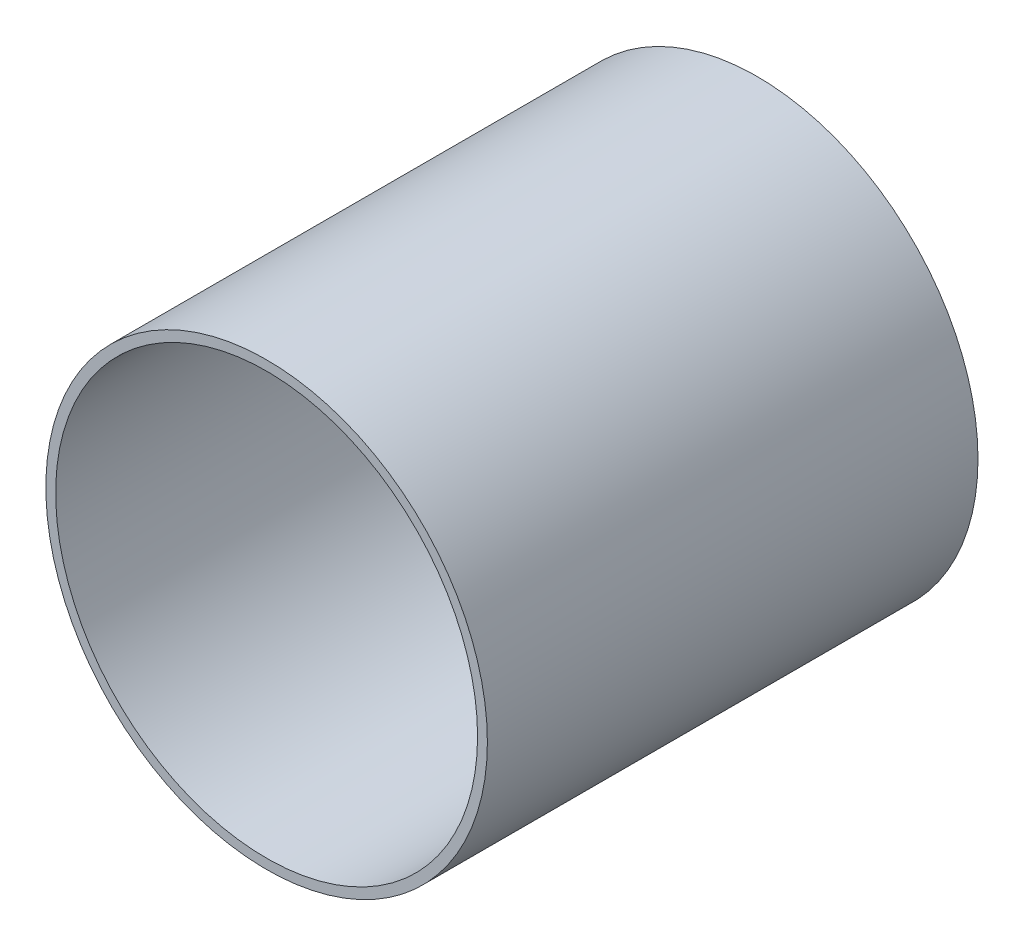
ISO-10303-21;
HEADER;
FILE_DESCRIPTION(('STEP AP214'),'2;1');
FILE_NAME('part.step','',(''),(''),'','','');
FILE_SCHEMA(('AUTOMOTIVE_DESIGN { 1 0 10303 214 1 1 1 1 }'));
ENDSEC;
DATA;
#1=APPLICATION_CONTEXT('core data for automotive mechanical design processes');
#2=APPLICATION_PROTOCOL_DEFINITION('international standard','automotive_design',2000,#1);
#3=PRODUCT_CONTEXT('',#1,'mechanical');
#4=PRODUCT('Part','Part','',(#3));
#5=PRODUCT_RELATED_PRODUCT_CATEGORY('part','',(#4));
#6=PRODUCT_DEFINITION_FORMATION('','',#4);
#7=PRODUCT_DEFINITION_CONTEXT('part definition',#1,'design');
#8=PRODUCT_DEFINITION('design','',#6,#7);
#9=PRODUCT_DEFINITION_SHAPE('','',#8);
#10=(LENGTH_UNIT() NAMED_UNIT(*) SI_UNIT(.MILLI.,.METRE.));
#11=(NAMED_UNIT(*) PLANE_ANGLE_UNIT() SI_UNIT($,.RADIAN.));
#12=(NAMED_UNIT(*) SI_UNIT($,.STERADIAN.) SOLID_ANGLE_UNIT());
#13=UNCERTAINTY_MEASURE_WITH_UNIT(LENGTH_MEASURE(1.E-05),#10,'distance_accuracy_value','');
#14=(GEOMETRIC_REPRESENTATION_CONTEXT(3) GLOBAL_UNCERTAINTY_ASSIGNED_CONTEXT((#13)) GLOBAL_UNIT_ASSIGNED_CONTEXT((#10,
#11,#12)) REPRESENTATION_CONTEXT('',''));
#15=CARTESIAN_POINT('',(0.,0.,0.));
#16=DIRECTION('',(0.,0.,1.));
#17=DIRECTION('',(1.,0.,0.));
#18=AXIS2_PLACEMENT_3D('',#15,#16,#17);
#19=CARTESIAN_POINT('',(0.,0.,100.));
#20=DIRECTION('',(0.,0.,1.));
#21=DIRECTION('',(1.,0.,0.));
#22=AXIS2_PLACEMENT_3D('',#19,#20,#21);
#23=PLANE('',#22);
#24=CARTESIAN_POINT('',(0.,0.,100.));
#25=DIRECTION('',(0.,0.,1.));
#26=DIRECTION('',(1.,0.,0.));
#27=AXIS2_PLACEMENT_3D('',#24,#25,#26);
#28=CIRCLE('',#27,45.);
#29=CARTESIAN_POINT('',(45.,0.,100.));
#30=VERTEX_POINT('',#29);
#31=EDGE_CURVE('E10',#30,#30,#28,.T.);
#32=ORIENTED_EDGE('',*,*,#31,.T.);
#33=EDGE_LOOP('',(#32));
#34=FACE_BOUND('',#33,.T.);
#35=CARTESIAN_POINT('',(0.,0.,100.));
#36=DIRECTION('',(0.,0.,1.));
#37=DIRECTION('',(1.,0.,0.));
#38=AXIS2_PLACEMENT_3D('',#35,#36,#37);
#39=CIRCLE('',#38,43.);
#40=CARTESIAN_POINT('',(43.,0.,100.));
#41=VERTEX_POINT('',#40);
#42=EDGE_CURVE('E42',#41,#41,#39,.T.);
#43=ORIENTED_EDGE('',*,*,#42,.F.);
#44=EDGE_LOOP('',(#43));
#45=FACE_BOUND('',#44,.T.);
#46=ADVANCED_FACE('F31',(#34,#45),#23,.T.);
#47=CARTESIAN_POINT('',(0.,0.,0.));
#48=DIRECTION('',(0.,0.,1.));
#49=DIRECTION('',(1.,0.,0.));
#50=AXIS2_PLACEMENT_3D('',#47,#48,#49);
#51=PLANE('',#50);
#52=CARTESIAN_POINT('',(0.,0.,0.));
#53=DIRECTION('',(0.,0.,1.));
#54=DIRECTION('',(1.,0.,0.));
#55=AXIS2_PLACEMENT_3D('',#52,#53,#54);
#56=CIRCLE('',#55,45.);
#57=CARTESIAN_POINT('',(45.,0.,0.));
#58=VERTEX_POINT('',#57);
#59=EDGE_CURVE('E35',#58,#58,#56,.T.);
#60=ORIENTED_EDGE('',*,*,#59,.F.);
#61=EDGE_LOOP('',(#60));
#62=FACE_BOUND('',#61,.T.);
#63=CARTESIAN_POINT('',(0.,0.,0.));
#64=DIRECTION('',(0.,0.,1.));
#65=DIRECTION('',(1.,0.,0.));
#66=AXIS2_PLACEMENT_3D('',#63,#64,#65);
#67=CIRCLE('',#66,43.);
#68=CARTESIAN_POINT('',(43.,0.,0.));
#69=VERTEX_POINT('',#68);
#70=EDGE_CURVE('E44',#69,#69,#67,.T.);
#71=ORIENTED_EDGE('',*,*,#70,.T.);
#72=EDGE_LOOP('',(#71));
#73=FACE_BOUND('',#72,.T.);
#74=ADVANCED_FACE('F54',(#62,#73),#51,.F.);
#75=CARTESIAN_POINT('',(0.,0.,100.));
#76=DIRECTION('',(0.,0.,-1.));
#77=DIRECTION('',(-1.,0.,0.));
#78=AXIS2_PLACEMENT_3D('',#75,#76,#77);
#79=CYLINDRICAL_SURFACE('',#78,45.);
#80=ORIENTED_EDGE('',*,*,#31,.F.);
#81=EDGE_LOOP('',(#80));
#82=FACE_BOUND('',#81,.T.);
#83=ORIENTED_EDGE('',*,*,#59,.T.);
#84=EDGE_LOOP('',(#83));
#85=FACE_BOUND('',#84,.T.);
#86=ADVANCED_FACE('F33',(#82,#85),#79,.T.);
#87=CARTESIAN_POINT('',(0.,0.,100.));
#88=DIRECTION('',(0.,0.,-1.));
#89=DIRECTION('',(-1.,0.,0.));
#90=AXIS2_PLACEMENT_3D('',#87,#88,#89);
#91=CYLINDRICAL_SURFACE('',#90,43.);
#92=ORIENTED_EDGE('',*,*,#42,.T.);
#93=EDGE_LOOP('',(#92));
#94=FACE_BOUND('',#93,.T.);
#95=ORIENTED_EDGE('',*,*,#70,.F.);
#96=EDGE_LOOP('',(#95));
#97=FACE_BOUND('',#96,.T.);
#98=ADVANCED_FACE('F50',(#94,#97),#91,.F.);
#99=CLOSED_SHELL('',(#46,#74,#86,#98));
#100=MANIFOLD_SOLID_BREP('B2',#99);
#101=ADVANCED_BREP_SHAPE_REPRESENTATION('',(#18,#100),#14);
#102=SHAPE_DEFINITION_REPRESENTATION(#9,#101);
ENDSEC;
END-ISO-10303-21;
